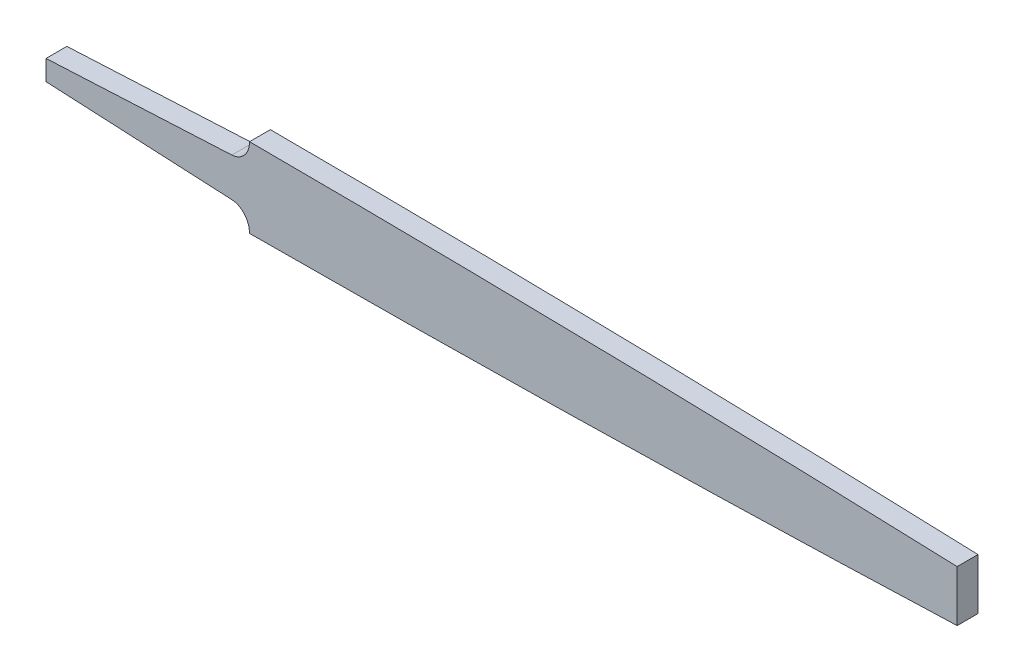
ISO-10303-21;
HEADER;
FILE_DESCRIPTION(('STEP AP214'),'2;1');
FILE_NAME('part.step','',(''),(''),'','','');
FILE_SCHEMA(('AUTOMOTIVE_DESIGN { 1 0 10303 214 1 1 1 1 }'));
ENDSEC;
DATA;
#1=APPLICATION_CONTEXT('core data for automotive mechanical design processes');
#2=APPLICATION_PROTOCOL_DEFINITION('international standard','automotive_design',2000,#1);
#3=PRODUCT_CONTEXT('',#1,'mechanical');
#4=PRODUCT('Part','Part','',(#3));
#5=PRODUCT_RELATED_PRODUCT_CATEGORY('part','',(#4));
#6=PRODUCT_DEFINITION_FORMATION('','',#4);
#7=PRODUCT_DEFINITION_CONTEXT('part definition',#1,'design');
#8=PRODUCT_DEFINITION('design','',#6,#7);
#9=PRODUCT_DEFINITION_SHAPE('','',#8);
#10=(LENGTH_UNIT() NAMED_UNIT(*) SI_UNIT(.MILLI.,.METRE.));
#11=(NAMED_UNIT(*) PLANE_ANGLE_UNIT() SI_UNIT($,.RADIAN.));
#12=(NAMED_UNIT(*) SI_UNIT($,.STERADIAN.) SOLID_ANGLE_UNIT());
#13=UNCERTAINTY_MEASURE_WITH_UNIT(LENGTH_MEASURE(1.E-05),#10,'distance_accuracy_value','');
#14=(GEOMETRIC_REPRESENTATION_CONTEXT(3) GLOBAL_UNCERTAINTY_ASSIGNED_CONTEXT((#13)) GLOBAL_UNIT_ASSIGNED_CONTEXT((#10,
#11,#12)) REPRESENTATION_CONTEXT('',''));
#15=CARTESIAN_POINT('',(0.,0.,0.));
#16=DIRECTION('',(0.,0.,1.));
#17=DIRECTION('',(1.,0.,0.));
#18=AXIS2_PLACEMENT_3D('',#15,#16,#17);
#19=CARTESIAN_POINT('',(-55.045,-8.6735,-2.277));
#20=CARTESIAN_POINT('',(22.2491760393189,-8.44879063920684,-2.277));
#21=CARTESIAN_POINT('',(99.485,-5.58250000000003,-2.277));
#22=B_SPLINE_CURVE_WITH_KNOTS('',2,(#19,#20,#21),.UNSPECIFIED.,.F.,.F.,(3,3),(0.,1.),.UNSPECIFIED.);
#23=DIRECTION('',(0.,0.,1.));
#24=VECTOR('',#23,1.);
#25=SURFACE_OF_LINEAR_EXTRUSION('',#22,#24);
#26=DIRECTION('',(0.,0.,1.));
#27=VECTOR('',#26,1.);
#28=CARTESIAN_POINT('',(99.485,-5.58249999999998,-2.277));
#29=LINE('',#28,#27);
#30=CARTESIAN_POINT('',(99.485,-5.58249999999998,-2.277));
#31=VERTEX_POINT('',#30);
#32=CARTESIAN_POINT('',(99.485,-5.58249999999998,2.277));
#33=VERTEX_POINT('',#32);
#34=EDGE_CURVE('E116',#31,#33,#29,.T.);
#35=ORIENTED_EDGE('',*,*,#34,.T.);
#36=CARTESIAN_POINT('',(-55.045,-8.6735,2.277));
#37=CARTESIAN_POINT('',(22.2491760393189,-8.44879063920684,2.277));
#38=CARTESIAN_POINT('',(99.485,-5.58250000000003,2.277));
#39=B_SPLINE_CURVE_WITH_KNOTS('',2,(#36,#37,#38),.UNSPECIFIED.,.F.,.F.,(3,3),(0.,1.),.UNSPECIFIED.);
#40=CARTESIAN_POINT('',(-55.045,-8.67349999999998,2.277));
#41=VERTEX_POINT('',#40);
#42=EDGE_CURVE('E230',#41,#33,#39,.T.);
#43=ORIENTED_EDGE('',*,*,#42,.F.);
#44=DIRECTION('',(0.,0.,1.));
#45=VECTOR('',#44,1.);
#46=CARTESIAN_POINT('',(-55.045,-8.67349999999998,-2.277));
#47=LINE('',#46,#45);
#48=CARTESIAN_POINT('',(-55.045,-8.67349999999998,-2.277));
#49=VERTEX_POINT('',#48);
#50=EDGE_CURVE('E11',#49,#41,#47,.T.);
#51=ORIENTED_EDGE('',*,*,#50,.F.);
#52=CARTESIAN_POINT('',(-55.045,-8.6735,-2.277));
#53=CARTESIAN_POINT('',(22.2491760393189,-8.44879063920684,-2.277));
#54=CARTESIAN_POINT('',(99.485,-5.58250000000003,-2.277));
#55=B_SPLINE_CURVE_WITH_KNOTS('',2,(#52,#53,#54),.UNSPECIFIED.,.F.,.F.,(3,3),(0.,1.),.UNSPECIFIED.);
#56=EDGE_CURVE('E129',#49,#31,#55,.T.);
#57=ORIENTED_EDGE('',*,*,#56,.T.);
#58=EDGE_LOOP('',(#35,#43,#51,#57));
#59=FACE_BOUND('',#58,.T.);
#60=ADVANCED_FACE('F36',(#59),#25,.T.);
#61=CARTESIAN_POINT('',(-55.045,-8.61391918456196,-2.277));
#62=DIRECTION('',(-1.,-2.35253001873919E-13,0.));
#63=DIRECTION('',(2.35253001873919E-13,-1.,0.));
#64=AXIS2_PLACEMENT_3D('',#61,#62,#63);
#65=PLANE('',#64);
#66=ORIENTED_EDGE('',*,*,#50,.T.);
#67=DIRECTION('',(2.35253001873919E-13,-1.,0.));
#68=VECTOR('',#67,1.);
#69=CARTESIAN_POINT('',(-55.045,-8.61391918456196,2.277));
#70=LINE('',#69,#68);
#71=CARTESIAN_POINT('',(-55.045,-8.61391918456196,2.277));
#72=VERTEX_POINT('',#71);
#73=EDGE_CURVE('E134',#72,#41,#70,.T.);
#74=ORIENTED_EDGE('',*,*,#73,.F.);
#75=DIRECTION('',(0.,0.,1.));
#76=VECTOR('',#75,1.);
#77=CARTESIAN_POINT('',(-55.045,-8.61391918456196,-2.277));
#78=LINE('',#77,#76);
#79=CARTESIAN_POINT('',(-55.045,-8.61391918456196,-2.277));
#80=VERTEX_POINT('',#79);
#81=EDGE_CURVE('E48',#80,#72,#78,.T.);
#82=ORIENTED_EDGE('',*,*,#81,.F.);
#83=DIRECTION('',(2.35253001873919E-13,-1.,0.));
#84=VECTOR('',#83,1.);
#85=CARTESIAN_POINT('',(-55.045,-8.61391918456196,-2.277));
#86=LINE('',#85,#84);
#87=EDGE_CURVE('E124',#80,#49,#86,.T.);
#88=ORIENTED_EDGE('',*,*,#87,.T.);
#89=EDGE_LOOP('',(#66,#74,#82,#88));
#90=FACE_BOUND('',#89,.T.);
#91=ADVANCED_FACE('F245',(#90),#65,.T.);
#92=CARTESIAN_POINT('',(-55.045,-8.61391918456196,-2.277));
#93=CARTESIAN_POINT('',(-55.045,0.186080815438041,-2.277));
#94=CARTESIAN_POINT('',(-63.125,0.186080815438041,-2.277));
#95=CARTESIAN_POINT('',(-63.125,-8.61391918456196,-2.277));
#96=CARTESIAN_POINT('',(-63.125,-17.4139191845619,-2.277));
#97=CARTESIAN_POINT('',(-55.045,-17.4139191845619,-2.277));
#98=CARTESIAN_POINT('',(-55.045,-8.61391918456196,-2.277));
#99=(BOUNDED_CURVE() B_SPLINE_CURVE(3,(#92,#93,#94,#95,#96,#97,#98),.UNSPECIFIED.,.T.,
.F.) B_SPLINE_CURVE_WITH_KNOTS((4,3,4),(0.,0.5,1.),
.UNSPECIFIED.) CURVE() GEOMETRIC_REPRESENTATION_ITEM() RATIONAL_B_SPLINE_CURVE((1.,
0.333333333333333,0.333333333333333,1.,0.333333333333333,0.333333333333333,1.)) REPRESENTATION_ITEM(''));
#100=DIRECTION('',(0.,0.,1.));
#101=VECTOR('',#100,1.);
#102=SURFACE_OF_LINEAR_EXTRUSION('',#99,#101);
#103=ORIENTED_EDGE('',*,*,#81,.T.);
#104=CARTESIAN_POINT('',(-58.9006987176369,-4.2185,2.277));
#105=CARTESIAN_POINT('',(-56.6212563697884,-4.33187029919822,2.277));
#106=CARTESIAN_POINT('',(-55.045,-6.12877093769051,2.277));
#107=CARTESIAN_POINT('',(-55.045,-8.61391918456196,2.277));
#108=(BOUNDED_CURVE() B_SPLINE_CURVE(3,(#104,#105,#106,#107),.UNSPECIFIED.,.F.,
.F.) B_SPLINE_CURVE_WITH_KNOTS((4,4),(0.,1.),
.UNSPECIFIED.) CURVE() GEOMETRIC_REPRESENTATION_ITEM() RATIONAL_B_SPLINE_CURVE((1.,
0.815370475585485,0.815370475585485,1.)) REPRESENTATION_ITEM(''));
#109=CARTESIAN_POINT('',(-58.9006987176369,-4.2185,2.277));
#110=VERTEX_POINT('',#109);
#111=EDGE_CURVE('E137',#110,#72,#108,.T.);
#112=ORIENTED_EDGE('',*,*,#111,.F.);
#113=DIRECTION('',(0.,0.,1.));
#114=VECTOR('',#113,1.);
#115=CARTESIAN_POINT('',(-58.9006987176369,-4.2185,-2.277));
#116=LINE('',#115,#114);
#117=CARTESIAN_POINT('',(-58.9006987176369,-4.2185,-2.277));
#118=VERTEX_POINT('',#117);
#119=EDGE_CURVE('E147',#118,#110,#116,.T.);
#120=ORIENTED_EDGE('',*,*,#119,.F.);
#121=CARTESIAN_POINT('',(-58.9006987176369,-4.2185,-2.277));
#122=CARTESIAN_POINT('',(-56.6212563697884,-4.33187029919822,-2.277));
#123=CARTESIAN_POINT('',(-55.045,-6.12877093769051,-2.277));
#124=CARTESIAN_POINT('',(-55.045,-8.61391918456196,-2.277));
#125=(BOUNDED_CURVE() B_SPLINE_CURVE(3,(#121,#122,#123,#124),.UNSPECIFIED.,.F.,
.F.) B_SPLINE_CURVE_WITH_KNOTS((4,4),(0.,1.),
.UNSPECIFIED.) CURVE() GEOMETRIC_REPRESENTATION_ITEM() RATIONAL_B_SPLINE_CURVE((1.,
0.815370475585485,0.815370475585485,1.)) REPRESENTATION_ITEM(''));
#126=EDGE_CURVE('E149',#118,#80,#125,.T.);
#127=ORIENTED_EDGE('',*,*,#126,.T.);
#128=EDGE_LOOP('',(#103,#112,#120,#127));
#129=FACE_BOUND('',#128,.T.);
#130=ADVANCED_FACE('F248',(#129),#102,.F.);
#131=CARTESIAN_POINT('',(-99.485,-2.2,-2.277));
#132=DIRECTION('',(-0.0496745788237375,-0.998765456059972,0.));
#133=DIRECTION('',(0.998765456059972,-0.0496745788237374,0.));
#134=AXIS2_PLACEMENT_3D('',#131,#132,#133);
#135=PLANE('',#134);
#136=ORIENTED_EDGE('',*,*,#119,.T.);
#137=DIRECTION('',(0.998765456059972,-0.0496745788237374,0.));
#138=VECTOR('',#137,1.);
#139=CARTESIAN_POINT('',(-99.485,-2.2,2.277));
#140=LINE('',#139,#138);
#141=CARTESIAN_POINT('',(-99.485,-2.2,2.277));
#142=VERTEX_POINT('',#141);
#143=EDGE_CURVE('E154',#142,#110,#140,.T.);
#144=ORIENTED_EDGE('',*,*,#143,.F.);
#145=DIRECTION('',(0.,0.,1.));
#146=VECTOR('',#145,1.);
#147=CARTESIAN_POINT('',(-99.485,-2.2,-2.277));
#148=LINE('',#147,#146);
#149=CARTESIAN_POINT('',(-99.485,-2.2,-2.277));
#150=VERTEX_POINT('',#149);
#151=EDGE_CURVE('E159',#150,#142,#148,.T.);
#152=ORIENTED_EDGE('',*,*,#151,.F.);
#153=DIRECTION('',(0.998765456059972,-0.0496745788237374,0.));
#154=VECTOR('',#153,1.);
#155=CARTESIAN_POINT('',(-99.485,-2.2,-2.277));
#156=LINE('',#155,#154);
#157=EDGE_CURVE('E164',#150,#118,#156,.T.);
#158=ORIENTED_EDGE('',*,*,#157,.T.);
#159=EDGE_LOOP('',(#136,#144,#152,#158));
#160=FACE_BOUND('',#159,.T.);
#161=ADVANCED_FACE('F252',(#160),#135,.T.);
#162=CARTESIAN_POINT('',(-99.485,-2.2,-2.277));
#163=DIRECTION('',(-1.,0.,0.));
#164=DIRECTION('',(0.,0.,1.));
#165=AXIS2_PLACEMENT_3D('',#162,#163,#164);
#166=PLANE('',#165);
#167=ORIENTED_EDGE('',*,*,#151,.T.);
#168=DIRECTION('',(0.,-1.,0.));
#169=VECTOR('',#168,1.);
#170=CARTESIAN_POINT('',(-99.485,-2.2,2.277));
#171=LINE('',#170,#169);
#172=CARTESIAN_POINT('',(-99.485,2.2,2.277));
#173=VERTEX_POINT('',#172);
#174=EDGE_CURVE('E170',#173,#142,#171,.T.);
#175=ORIENTED_EDGE('',*,*,#174,.F.);
#176=DIRECTION('',(0.,0.,1.));
#177=VECTOR('',#176,1.);
#178=CARTESIAN_POINT('',(-99.485,2.2,-2.277));
#179=LINE('',#178,#177);
#180=CARTESIAN_POINT('',(-99.485,2.2,-2.277));
#181=VERTEX_POINT('',#180);
#182=EDGE_CURVE('E172',#181,#173,#179,.T.);
#183=ORIENTED_EDGE('',*,*,#182,.F.);
#184=DIRECTION('',(0.,-1.,0.));
#185=VECTOR('',#184,1.);
#186=CARTESIAN_POINT('',(-99.485,-2.2,-2.277));
#187=LINE('',#186,#185);
#188=EDGE_CURVE('E175',#181,#150,#187,.T.);
#189=ORIENTED_EDGE('',*,*,#188,.T.);
#190=EDGE_LOOP('',(#167,#175,#183,#189));
#191=FACE_BOUND('',#190,.T.);
#192=ADVANCED_FACE('F256',(#191),#166,.T.);
#193=CARTESIAN_POINT('',(-99.485,2.2,-2.277));
#194=DIRECTION('',(-0.0496745788237374,0.998765456059972,0.));
#195=DIRECTION('',(-0.998765456059972,-0.0496745788237374,0.));
#196=AXIS2_PLACEMENT_3D('',#193,#194,#195);
#197=PLANE('',#196);
#198=ORIENTED_EDGE('',*,*,#182,.T.);
#199=DIRECTION('',(-0.998765456059972,-0.0496745788237374,0.));
#200=VECTOR('',#199,1.);
#201=CARTESIAN_POINT('',(-99.485,2.2,2.277));
#202=LINE('',#201,#200);
#203=CARTESIAN_POINT('',(-58.9006987176369,4.2185,2.277));
#204=VERTEX_POINT('',#203);
#205=EDGE_CURVE('E178',#204,#173,#202,.T.);
#206=ORIENTED_EDGE('',*,*,#205,.F.);
#207=DIRECTION('',(0.,0.,1.));
#208=VECTOR('',#207,1.);
#209=CARTESIAN_POINT('',(-58.9006987176369,4.2185,-2.277));
#210=LINE('',#209,#208);
#211=CARTESIAN_POINT('',(-58.9006987176369,4.2185,-2.277));
#212=VERTEX_POINT('',#211);
#213=EDGE_CURVE('E180',#212,#204,#210,.T.);
#214=ORIENTED_EDGE('',*,*,#213,.F.);
#215=DIRECTION('',(-0.998765456059972,-0.0496745788237374,0.));
#216=VECTOR('',#215,1.);
#217=CARTESIAN_POINT('',(-99.485,2.2,-2.277));
#218=LINE('',#217,#216);
#219=EDGE_CURVE('E183',#212,#181,#218,.T.);
#220=ORIENTED_EDGE('',*,*,#219,.T.);
#221=EDGE_LOOP('',(#198,#206,#214,#220));
#222=FACE_BOUND('',#221,.T.);
#223=ADVANCED_FACE('F260',(#222),#197,.T.);
#224=CARTESIAN_POINT('',(-55.045,8.61391918456196,-2.277));
#225=CARTESIAN_POINT('',(-55.045,17.4139191845619,-2.277));
#226=CARTESIAN_POINT('',(-63.125,17.4139191845619,-2.277));
#227=CARTESIAN_POINT('',(-63.125,8.61391918456196,-2.277));
#228=CARTESIAN_POINT('',(-63.125,-0.186080815438041,-2.277));
#229=CARTESIAN_POINT('',(-55.045,-0.186080815438041,-2.277));
#230=CARTESIAN_POINT('',(-55.045,8.61391918456196,-2.277));
#231=(BOUNDED_CURVE() B_SPLINE_CURVE(3,(#224,#225,#226,#227,#228,#229,#230),.UNSPECIFIED.,.T.,
.F.) B_SPLINE_CURVE_WITH_KNOTS((4,3,4),(0.,0.5,1.),
.UNSPECIFIED.) CURVE() GEOMETRIC_REPRESENTATION_ITEM() RATIONAL_B_SPLINE_CURVE((1.,
0.333333333333333,0.333333333333333,1.,0.333333333333333,0.333333333333333,1.)) REPRESENTATION_ITEM(''));
#232=DIRECTION('',(0.,0.,1.));
#233=VECTOR('',#232,1.);
#234=SURFACE_OF_LINEAR_EXTRUSION('',#231,#233);
#235=ORIENTED_EDGE('',*,*,#213,.T.);
#236=CARTESIAN_POINT('',(-55.045,8.61391918456196,2.277));
#237=CARTESIAN_POINT('',(-55.045,6.12877093769051,2.277));
#238=CARTESIAN_POINT('',(-56.6212563697884,4.33187029919822,2.277));
#239=CARTESIAN_POINT('',(-58.9006987176369,4.2185,2.277));
#240=(BOUNDED_CURVE() B_SPLINE_CURVE(3,(#236,#237,#238,#239),.UNSPECIFIED.,.F.,
.F.) B_SPLINE_CURVE_WITH_KNOTS((4,4),(0.,1.),
.UNSPECIFIED.) CURVE() GEOMETRIC_REPRESENTATION_ITEM() RATIONAL_B_SPLINE_CURVE((1.,
0.815370475585485,0.815370475585485,1.)) REPRESENTATION_ITEM(''));
#241=CARTESIAN_POINT('',(-55.045,8.61391918456196,2.277));
#242=VERTEX_POINT('',#241);
#243=EDGE_CURVE('E186',#242,#204,#240,.T.);
#244=ORIENTED_EDGE('',*,*,#243,.F.);
#245=DIRECTION('',(0.,0.,1.));
#246=VECTOR('',#245,1.);
#247=CARTESIAN_POINT('',(-55.045,8.61391918456196,-2.277));
#248=LINE('',#247,#246);
#249=CARTESIAN_POINT('',(-55.045,8.61391918456196,-2.277));
#250=VERTEX_POINT('',#249);
#251=EDGE_CURVE('E188',#250,#242,#248,.T.);
#252=ORIENTED_EDGE('',*,*,#251,.F.);
#253=CARTESIAN_POINT('',(-55.045,8.61391918456196,-2.277));
#254=CARTESIAN_POINT('',(-55.045,6.12877093769051,-2.277));
#255=CARTESIAN_POINT('',(-56.6212563697884,4.33187029919822,-2.277));
#256=CARTESIAN_POINT('',(-58.9006987176369,4.2185,-2.277));
#257=(BOUNDED_CURVE() B_SPLINE_CURVE(3,(#253,#254,#255,#256),.UNSPECIFIED.,.F.,
.F.) B_SPLINE_CURVE_WITH_KNOTS((4,4),(0.,1.),
.UNSPECIFIED.) CURVE() GEOMETRIC_REPRESENTATION_ITEM() RATIONAL_B_SPLINE_CURVE((1.,
0.815370475585485,0.815370475585485,1.)) REPRESENTATION_ITEM(''));
#258=EDGE_CURVE('E191',#250,#212,#257,.T.);
#259=ORIENTED_EDGE('',*,*,#258,.T.);
#260=EDGE_LOOP('',(#235,#244,#252,#259));
#261=FACE_BOUND('',#260,.T.);
#262=ADVANCED_FACE('F264',(#261),#234,.F.);
#263=CARTESIAN_POINT('',(-55.045,8.61391918456196,-2.277));
#264=DIRECTION('',(-1.,2.35253001873858E-13,0.));
#265=DIRECTION('',(-2.35253001873858E-13,-1.,0.));
#266=AXIS2_PLACEMENT_3D('',#263,#264,#265);
#267=PLANE('',#266);
#268=ORIENTED_EDGE('',*,*,#251,.T.);
#269=DIRECTION('',(-2.35253001873858E-13,-1.,0.));
#270=VECTOR('',#269,1.);
#271=CARTESIAN_POINT('',(-55.045,8.61391918456196,2.277));
#272=LINE('',#271,#270);
#273=CARTESIAN_POINT('',(-55.045,8.6735,2.277));
#274=VERTEX_POINT('',#273);
#275=EDGE_CURVE('E196',#274,#242,#272,.T.);
#276=ORIENTED_EDGE('',*,*,#275,.F.);
#277=DIRECTION('',(0.,0.,1.));
#278=VECTOR('',#277,1.);
#279=CARTESIAN_POINT('',(-55.045,8.6735,-2.277));
#280=LINE('',#279,#278);
#281=CARTESIAN_POINT('',(-55.045,8.6735,-2.277));
#282=VERTEX_POINT('',#281);
#283=EDGE_CURVE('E201',#282,#274,#280,.T.);
#284=ORIENTED_EDGE('',*,*,#283,.F.);
#285=DIRECTION('',(-2.35253001873858E-13,-1.,0.));
#286=VECTOR('',#285,1.);
#287=CARTESIAN_POINT('',(-55.045,8.61391918456196,-2.277));
#288=LINE('',#287,#286);
#289=EDGE_CURVE('E206',#282,#250,#288,.T.);
#290=ORIENTED_EDGE('',*,*,#289,.T.);
#291=EDGE_LOOP('',(#268,#276,#284,#290));
#292=FACE_BOUND('',#291,.T.);
#293=ADVANCED_FACE('F268',(#292),#267,.T.);
#294=CARTESIAN_POINT('',(99.485,5.58250000000003,-2.277));
#295=CARTESIAN_POINT('',(22.2491760393188,8.44879063920684,-2.277));
#296=CARTESIAN_POINT('',(-55.045,8.6735,-2.277));
#297=B_SPLINE_CURVE_WITH_KNOTS('',2,(#294,#295,#296),.UNSPECIFIED.,.F.,.F.,(3,3),(0.,1.),.UNSPECIFIED.);
#298=DIRECTION('',(0.,0.,1.));
#299=VECTOR('',#298,1.);
#300=SURFACE_OF_LINEAR_EXTRUSION('',#297,#299);
#301=ORIENTED_EDGE('',*,*,#283,.T.);
#302=CARTESIAN_POINT('',(99.485,5.58250000000003,2.277));
#303=CARTESIAN_POINT('',(22.2491760393188,8.44879063920684,2.277));
#304=CARTESIAN_POINT('',(-55.045,8.6735,2.277));
#305=B_SPLINE_CURVE_WITH_KNOTS('',2,(#302,#303,#304),.UNSPECIFIED.,.F.,.F.,(3,3),(0.,1.),.UNSPECIFIED.);
#306=CARTESIAN_POINT('',(99.485,5.58250000000004,2.277));
#307=VERTEX_POINT('',#306);
#308=EDGE_CURVE('E212',#307,#274,#305,.T.);
#309=ORIENTED_EDGE('',*,*,#308,.F.);
#310=DIRECTION('',(0.,0.,1.));
#311=VECTOR('',#310,1.);
#312=CARTESIAN_POINT('',(99.485,5.58250000000004,-2.277));
#313=LINE('',#312,#311);
#314=CARTESIAN_POINT('',(99.485,5.58250000000004,-2.277));
#315=VERTEX_POINT('',#314);
#316=EDGE_CURVE('E109',#315,#307,#313,.T.);
#317=ORIENTED_EDGE('',*,*,#316,.F.);
#318=CARTESIAN_POINT('',(99.485,5.58250000000003,-2.277));
#319=CARTESIAN_POINT('',(22.2491760393188,8.44879063920684,-2.277));
#320=CARTESIAN_POINT('',(-55.045,8.6735,-2.277));
#321=B_SPLINE_CURVE_WITH_KNOTS('',2,(#318,#319,#320),.UNSPECIFIED.,.F.,.F.,(3,3),(0.,1.),.UNSPECIFIED.);
#322=EDGE_CURVE('E132',#315,#282,#321,.T.);
#323=ORIENTED_EDGE('',*,*,#322,.T.);
#324=EDGE_LOOP('',(#301,#309,#317,#323));
#325=FACE_BOUND('',#324,.T.);
#326=ADVANCED_FACE('F278',(#325),#300,.T.);
#327=CARTESIAN_POINT('',(99.485,5.58250000000004,-2.277));
#328=DIRECTION('',(1.,0.,0.));
#329=DIRECTION('',(0.,0.,-1.));
#330=AXIS2_PLACEMENT_3D('',#327,#328,#329);
#331=PLANE('',#330);
#332=ORIENTED_EDGE('',*,*,#316,.T.);
#333=DIRECTION('',(0.,1.,0.));
#334=VECTOR('',#333,1.);
#335=CARTESIAN_POINT('',(99.485,5.58250000000004,2.277));
#336=LINE('',#335,#334);
#337=EDGE_CURVE('E122',#33,#307,#336,.T.);
#338=ORIENTED_EDGE('',*,*,#337,.F.);
#339=ORIENTED_EDGE('',*,*,#34,.F.);
#340=DIRECTION('',(0.,1.,0.));
#341=VECTOR('',#340,1.);
#342=CARTESIAN_POINT('',(99.485,5.58250000000004,-2.277));
#343=LINE('',#342,#341);
#344=EDGE_CURVE('E119',#31,#315,#343,.T.);
#345=ORIENTED_EDGE('',*,*,#344,.T.);
#346=EDGE_LOOP('',(#332,#338,#339,#345));
#347=FACE_BOUND('',#346,.T.);
#348=ADVANCED_FACE('F118',(#347),#331,.T.);
#349=CARTESIAN_POINT('',(22.2345880196594,-7.78839531960343,-2.277));
#350=DIRECTION('',(0.,0.,-1.));
#351=DIRECTION('',(-1.,0.,0.));
#352=AXIS2_PLACEMENT_3D('',#349,#350,#351);
#353=PLANE('',#352);
#354=ORIENTED_EDGE('',*,*,#56,.F.);
#355=ORIENTED_EDGE('',*,*,#87,.F.);
#356=ORIENTED_EDGE('',*,*,#126,.F.);
#357=ORIENTED_EDGE('',*,*,#157,.F.);
#358=ORIENTED_EDGE('',*,*,#188,.F.);
#359=ORIENTED_EDGE('',*,*,#219,.F.);
#360=ORIENTED_EDGE('',*,*,#258,.F.);
#361=ORIENTED_EDGE('',*,*,#289,.F.);
#362=ORIENTED_EDGE('',*,*,#322,.F.);
#363=ORIENTED_EDGE('',*,*,#344,.F.);
#364=EDGE_LOOP('',(#354,#355,#356,#357,#358,#359,#360,#361,#362,#363));
#365=FACE_BOUND('',#364,.T.);
#366=ADVANCED_FACE('F127',(#365),#353,.T.);
#367=CARTESIAN_POINT('',(22.2345880196594,-7.78839531960343,2.277));
#368=DIRECTION('',(0.,0.,-1.));
#369=DIRECTION('',(-1.,0.,0.));
#370=AXIS2_PLACEMENT_3D('',#367,#368,#369);
#371=PLANE('',#370);
#372=ORIENTED_EDGE('',*,*,#42,.T.);
#373=ORIENTED_EDGE('',*,*,#337,.T.);
#374=ORIENTED_EDGE('',*,*,#308,.T.);
#375=ORIENTED_EDGE('',*,*,#275,.T.);
#376=ORIENTED_EDGE('',*,*,#243,.T.);
#377=ORIENTED_EDGE('',*,*,#205,.T.);
#378=ORIENTED_EDGE('',*,*,#174,.T.);
#379=ORIENTED_EDGE('',*,*,#143,.T.);
#380=ORIENTED_EDGE('',*,*,#111,.T.);
#381=ORIENTED_EDGE('',*,*,#73,.T.);
#382=EDGE_LOOP('',(#372,#373,#374,#375,#376,#377,#378,#379,#380,#381));
#383=FACE_BOUND('',#382,.T.);
#384=ADVANCED_FACE('F38',(#383),#371,.F.);
#385=CLOSED_SHELL('',(#60,#91,#130,#161,#192,#223,#262,#293,#326,#348,#366,#384));
#386=MANIFOLD_SOLID_BREP('B2',#385);
#387=ADVANCED_BREP_SHAPE_REPRESENTATION('',(#18,#386),#14);
#388=SHAPE_DEFINITION_REPRESENTATION(#9,#387);
ENDSEC;
END-ISO-10303-21;
